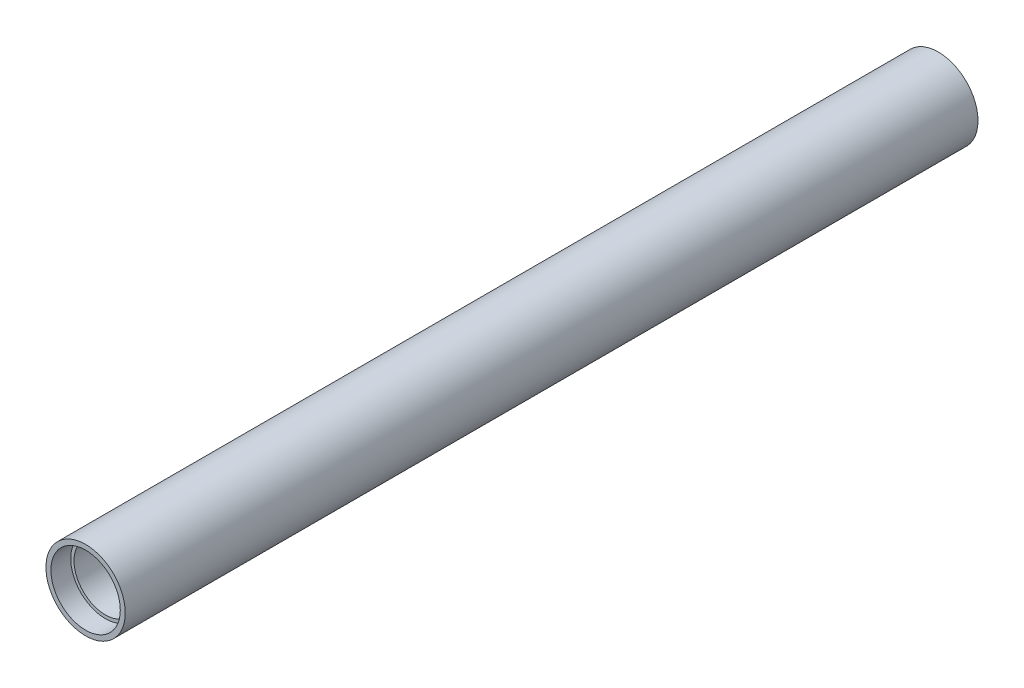
ISO-10303-21;
HEADER;
FILE_DESCRIPTION(('STEP AP214'),'2;1');
FILE_NAME('part.step','',(''),(''),'','','');
FILE_SCHEMA(('AUTOMOTIVE_DESIGN { 1 0 10303 214 1 1 1 1 }'));
ENDSEC;
DATA;
#1=APPLICATION_CONTEXT('core data for automotive mechanical design processes');
#2=APPLICATION_PROTOCOL_DEFINITION('international standard','automotive_design',2000,#1);
#3=PRODUCT_CONTEXT('',#1,'mechanical');
#4=PRODUCT('Part','Part','',(#3));
#5=PRODUCT_RELATED_PRODUCT_CATEGORY('part','',(#4));
#6=PRODUCT_DEFINITION_FORMATION('','',#4);
#7=PRODUCT_DEFINITION_CONTEXT('part definition',#1,'design');
#8=PRODUCT_DEFINITION('design','',#6,#7);
#9=PRODUCT_DEFINITION_SHAPE('','',#8);
#10=(LENGTH_UNIT() NAMED_UNIT(*) SI_UNIT(.MILLI.,.METRE.));
#11=(NAMED_UNIT(*) PLANE_ANGLE_UNIT() SI_UNIT($,.RADIAN.));
#12=(NAMED_UNIT(*) SI_UNIT($,.STERADIAN.) SOLID_ANGLE_UNIT());
#13=UNCERTAINTY_MEASURE_WITH_UNIT(LENGTH_MEASURE(1.E-05),#10,'distance_accuracy_value','');
#14=(GEOMETRIC_REPRESENTATION_CONTEXT(3) GLOBAL_UNCERTAINTY_ASSIGNED_CONTEXT((#13)) GLOBAL_UNIT_ASSIGNED_CONTEXT((#10,
#11,#12)) REPRESENTATION_CONTEXT('',''));
#15=CARTESIAN_POINT('',(0.,0.,0.));
#16=DIRECTION('',(0.,0.,1.));
#17=DIRECTION('',(1.,0.,0.));
#18=AXIS2_PLACEMENT_3D('',#15,#16,#17);
#19=CARTESIAN_POINT('',(0.,0.,516.));
#20=DIRECTION('',(0.,0.,-1.));
#21=DIRECTION('',(-1.,0.,0.));
#22=AXIS2_PLACEMENT_3D('',#19,#20,#21);
#23=CYLINDRICAL_SURFACE('',#22,19.);
#24=CARTESIAN_POINT('',(0.,0.,504.));
#25=DIRECTION('',(0.,0.,1.));
#26=DIRECTION('',(1.,0.,0.));
#27=AXIS2_PLACEMENT_3D('',#24,#25,#26);
#28=CIRCLE('',#27,19.);
#29=CARTESIAN_POINT('',(19.,0.,504.));
#30=VERTEX_POINT('',#29);
#31=EDGE_CURVE('E48',#30,#30,#28,.T.);
#32=ORIENTED_EDGE('',*,*,#31,.T.);
#33=EDGE_LOOP('',(#32));
#34=FACE_BOUND('',#33,.T.);
#35=CARTESIAN_POINT('',(0.,0.,12.));
#36=DIRECTION('',(0.,0.,-1.));
#37=DIRECTION('',(-1.,0.,0.));
#38=AXIS2_PLACEMENT_3D('',#35,#36,#37);
#39=CIRCLE('',#38,19.);
#40=CARTESIAN_POINT('',(-19.,0.,12.));
#41=VERTEX_POINT('',#40);
#42=EDGE_CURVE('E57',#41,#41,#39,.T.);
#43=ORIENTED_EDGE('',*,*,#42,.T.);
#44=EDGE_LOOP('',(#43));
#45=FACE_BOUND('',#44,.T.);
#46=ADVANCED_FACE('F32',(#34,#45),#23,.F.);
#47=CARTESIAN_POINT('',(0.,0.,516.));
#48=DIRECTION('',(0.,0.,1.));
#49=DIRECTION('',(1.,0.,0.));
#50=AXIS2_PLACEMENT_3D('',#47,#48,#49);
#51=PLANE('',#50);
#52=CARTESIAN_POINT('',(0.,0.,516.));
#53=DIRECTION('',(0.,0.,1.));
#54=DIRECTION('',(1.,0.,0.));
#55=AXIS2_PLACEMENT_3D('',#52,#53,#54);
#56=CIRCLE('',#55,21.);
#57=CARTESIAN_POINT('',(21.,0.,516.));
#58=VERTEX_POINT('',#57);
#59=EDGE_CURVE('E45',#58,#58,#56,.T.);
#60=ORIENTED_EDGE('',*,*,#59,.F.);
#61=EDGE_LOOP('',(#60));
#62=FACE_BOUND('',#61,.T.);
#63=CARTESIAN_POINT('',(0.,0.,516.));
#64=DIRECTION('',(0.,0.,1.));
#65=DIRECTION('',(1.,0.,0.));
#66=AXIS2_PLACEMENT_3D('',#63,#64,#65);
#67=CIRCLE('',#66,24.);
#68=CARTESIAN_POINT('',(24.,0.,516.));
#69=VERTEX_POINT('',#68);
#70=EDGE_CURVE('E10',#69,#69,#67,.T.);
#71=ORIENTED_EDGE('',*,*,#70,.T.);
#72=EDGE_LOOP('',(#71));
#73=FACE_BOUND('',#72,.T.);
#74=ADVANCED_FACE('F80',(#62,#73),#51,.T.);
#75=CARTESIAN_POINT('',(0.,0.,0.));
#76=DIRECTION('',(0.,0.,1.));
#77=DIRECTION('',(1.,0.,0.));
#78=AXIS2_PLACEMENT_3D('',#75,#76,#77);
#79=PLANE('',#78);
#80=CARTESIAN_POINT('',(0.,0.,0.));
#81=DIRECTION('',(0.,0.,-1.));
#82=DIRECTION('',(-1.,0.,0.));
#83=AXIS2_PLACEMENT_3D('',#80,#81,#82);
#84=CIRCLE('',#83,21.);
#85=CARTESIAN_POINT('',(-21.,0.,0.));
#86=VERTEX_POINT('',#85);
#87=EDGE_CURVE('E54',#86,#86,#84,.T.);
#88=ORIENTED_EDGE('',*,*,#87,.F.);
#89=EDGE_LOOP('',(#88));
#90=FACE_BOUND('',#89,.T.);
#91=CARTESIAN_POINT('',(0.,0.,0.));
#92=DIRECTION('',(0.,0.,1.));
#93=DIRECTION('',(1.,0.,0.));
#94=AXIS2_PLACEMENT_3D('',#91,#92,#93);
#95=CIRCLE('',#94,24.);
#96=CARTESIAN_POINT('',(24.,0.,0.));
#97=VERTEX_POINT('',#96);
#98=EDGE_CURVE('E36',#97,#97,#95,.T.);
#99=ORIENTED_EDGE('',*,*,#98,.F.);
#100=EDGE_LOOP('',(#99));
#101=FACE_BOUND('',#100,.T.);
#102=ADVANCED_FACE('F77',(#90,#101),#79,.F.);
#103=CARTESIAN_POINT('',(0.,0.,516.));
#104=DIRECTION('',(0.,0.,-1.));
#105=DIRECTION('',(-1.,0.,0.));
#106=AXIS2_PLACEMENT_3D('',#103,#104,#105);
#107=CYLINDRICAL_SURFACE('',#106,24.);
#108=ORIENTED_EDGE('',*,*,#70,.F.);
#109=EDGE_LOOP('',(#108));
#110=FACE_BOUND('',#109,.T.);
#111=ORIENTED_EDGE('',*,*,#98,.T.);
#112=EDGE_LOOP('',(#111));
#113=FACE_BOUND('',#112,.T.);
#114=ADVANCED_FACE('F34',(#110,#113),#107,.T.);
#115=CARTESIAN_POINT('',(0.,0.,504.));
#116=DIRECTION('',(0.,0.,1.));
#117=DIRECTION('',(1.,0.,0.));
#118=AXIS2_PLACEMENT_3D('',#115,#116,#117);
#119=CYLINDRICAL_SURFACE('',#118,21.);
#120=CARTESIAN_POINT('',(0.,0.,504.));
#121=DIRECTION('',(0.,0.,1.));
#122=DIRECTION('',(1.,0.,0.));
#123=AXIS2_PLACEMENT_3D('',#120,#121,#122);
#124=CIRCLE('',#123,21.);
#125=CARTESIAN_POINT('',(21.,0.,504.));
#126=VERTEX_POINT('',#125);
#127=EDGE_CURVE('E43',#126,#126,#124,.T.);
#128=ORIENTED_EDGE('',*,*,#127,.F.);
#129=EDGE_LOOP('',(#128));
#130=FACE_BOUND('',#129,.T.);
#131=ORIENTED_EDGE('',*,*,#59,.T.);
#132=EDGE_LOOP('',(#131));
#133=FACE_BOUND('',#132,.T.);
#134=ADVANCED_FACE('F84',(#130,#133),#119,.F.);
#135=CARTESIAN_POINT('',(0.,0.,504.));
#136=DIRECTION('',(0.,0.,1.));
#137=DIRECTION('',(1.,0.,0.));
#138=AXIS2_PLACEMENT_3D('',#135,#136,#137);
#139=PLANE('',#138);
#140=ORIENTED_EDGE('',*,*,#31,.F.);
#141=EDGE_LOOP('',(#140));
#142=FACE_BOUND('',#141,.T.);
#143=ORIENTED_EDGE('',*,*,#127,.T.);
#144=EDGE_LOOP('',(#143));
#145=FACE_BOUND('',#144,.T.);
#146=ADVANCED_FACE('F73',(#142,#145),#139,.T.);
#147=CARTESIAN_POINT('',(0.,0.,12.));
#148=DIRECTION('',(0.,0.,-1.));
#149=DIRECTION('',(-1.,0.,0.));
#150=AXIS2_PLACEMENT_3D('',#147,#148,#149);
#151=CYLINDRICAL_SURFACE('',#150,21.);
#152=CARTESIAN_POINT('',(0.,0.,12.));
#153=DIRECTION('',(0.,0.,-1.));
#154=DIRECTION('',(-1.,0.,0.));
#155=AXIS2_PLACEMENT_3D('',#152,#153,#154);
#156=CIRCLE('',#155,21.);
#157=CARTESIAN_POINT('',(-21.,0.,12.));
#158=VERTEX_POINT('',#157);
#159=EDGE_CURVE('E53',#158,#158,#156,.T.);
#160=ORIENTED_EDGE('',*,*,#159,.F.);
#161=EDGE_LOOP('',(#160));
#162=FACE_BOUND('',#161,.T.);
#163=ORIENTED_EDGE('',*,*,#87,.T.);
#164=EDGE_LOOP('',(#163));
#165=FACE_BOUND('',#164,.T.);
#166=ADVANCED_FACE('F67',(#162,#165),#151,.F.);
#167=CARTESIAN_POINT('',(0.,0.,12.));
#168=DIRECTION('',(0.,0.,-1.));
#169=DIRECTION('',(-1.,0.,0.));
#170=AXIS2_PLACEMENT_3D('',#167,#168,#169);
#171=PLANE('',#170);
#172=ORIENTED_EDGE('',*,*,#42,.F.);
#173=EDGE_LOOP('',(#172));
#174=FACE_BOUND('',#173,.T.);
#175=ORIENTED_EDGE('',*,*,#159,.T.);
#176=EDGE_LOOP('',(#175));
#177=FACE_BOUND('',#176,.T.);
#178=ADVANCED_FACE('F64',(#174,#177),#171,.T.);
#179=CLOSED_SHELL('',(#46,#74,#102,#114,#134,#146,#166,#178));
#180=MANIFOLD_SOLID_BREP('B2',#179);
#181=ADVANCED_BREP_SHAPE_REPRESENTATION('',(#18,#180),#14);
#182=SHAPE_DEFINITION_REPRESENTATION(#9,#181);
ENDSEC;
END-ISO-10303-21;
